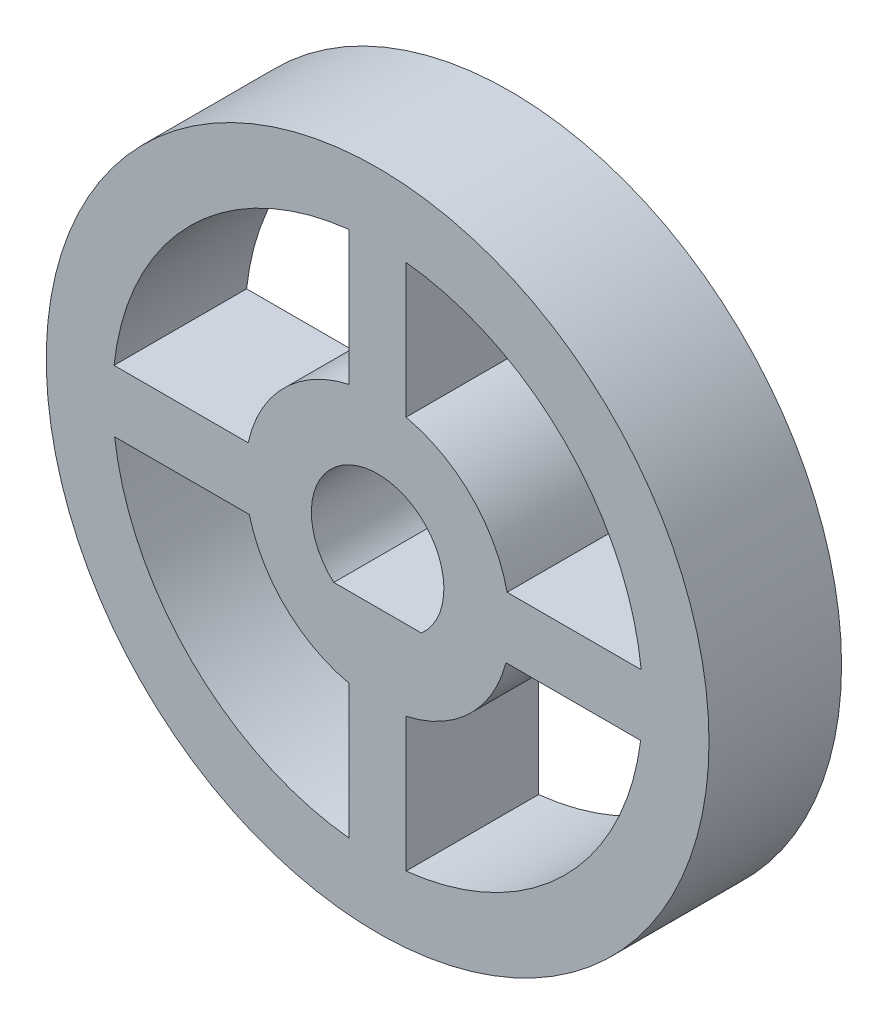
ISO-10303-21;
HEADER;
FILE_DESCRIPTION(('STEP AP214'),'2;1');
FILE_NAME('part.step','',(''),(''),'','','');
FILE_SCHEMA(('AUTOMOTIVE_DESIGN { 1 0 10303 214 1 1 1 1 }'));
ENDSEC;
DATA;
#1=APPLICATION_CONTEXT('core data for automotive mechanical design processes');
#2=APPLICATION_PROTOCOL_DEFINITION('international standard','automotive_design',2000,#1);
#3=PRODUCT_CONTEXT('',#1,'mechanical');
#4=PRODUCT('Part','Part','',(#3));
#5=PRODUCT_RELATED_PRODUCT_CATEGORY('part','',(#4));
#6=PRODUCT_DEFINITION_FORMATION('','',#4);
#7=PRODUCT_DEFINITION_CONTEXT('part definition',#1,'design');
#8=PRODUCT_DEFINITION('design','',#6,#7);
#9=PRODUCT_DEFINITION_SHAPE('','',#8);
#10=(LENGTH_UNIT() NAMED_UNIT(*) SI_UNIT(.MILLI.,.METRE.));
#11=(NAMED_UNIT(*) PLANE_ANGLE_UNIT() SI_UNIT($,.RADIAN.));
#12=(NAMED_UNIT(*) SI_UNIT($,.STERADIAN.) SOLID_ANGLE_UNIT());
#13=UNCERTAINTY_MEASURE_WITH_UNIT(LENGTH_MEASURE(1.E-05),#10,'distance_accuracy_value','');
#14=(GEOMETRIC_REPRESENTATION_CONTEXT(3) GLOBAL_UNCERTAINTY_ASSIGNED_CONTEXT((#13)) GLOBAL_UNIT_ASSIGNED_CONTEXT((#10,
#11,#12)) REPRESENTATION_CONTEXT('',''));
#15=CARTESIAN_POINT('',(0.,0.,0.));
#16=DIRECTION('',(0.,0.,1.));
#17=DIRECTION('',(1.,0.,0.));
#18=AXIS2_PLACEMENT_3D('',#15,#16,#17);
#19=CARTESIAN_POINT('',(0.,0.,6.));
#20=DIRECTION('',(0.,0.,1.));
#21=DIRECTION('',(1.,0.,0.));
#22=AXIS2_PLACEMENT_3D('',#19,#20,#21);
#23=PLANE('',#22);
#24=CARTESIAN_POINT('',(0.,0.,6.));
#25=DIRECTION('',(0.,0.,1.));
#26=DIRECTION('',(1.,0.,0.));
#27=AXIS2_PLACEMENT_3D('',#24,#25,#26);
#28=CIRCLE('',#27,15.);
#29=CARTESIAN_POINT('',(15.,0.,6.));
#30=VERTEX_POINT('',#29);
#31=EDGE_CURVE('E11',#30,#30,#28,.T.);
#32=ORIENTED_EDGE('',*,*,#31,.T.);
#33=EDGE_LOOP('',(#32));
#34=FACE_BOUND('',#33,.T.);
#35=DIRECTION('',(0.,1.,0.));
#36=VECTOR('',#35,1.);
#37=CARTESIAN_POINT('',(-1.28571428571429,5.86062614193315,6.));
#38=LINE('',#37,#36);
#39=CARTESIAN_POINT('',(-1.28571428571429,5.86062614193315,6.));
#40=VERTEX_POINT('',#39);
#41=CARTESIAN_POINT('',(-1.28571428571428,11.9309236346358,6.));
#42=VERTEX_POINT('',#41);
#43=EDGE_CURVE('E327',#40,#42,#38,.T.);
#44=ORIENTED_EDGE('',*,*,#43,.F.);
#45=CARTESIAN_POINT('',(0.,0.,6.));
#46=DIRECTION('',(0.,0.,-1.));
#47=DIRECTION('',(1.,0.,0.));
#48=AXIS2_PLACEMENT_3D('',#45,#46,#47);
#49=CIRCLE('',#48,6.);
#50=CARTESIAN_POINT('',(-5.86062614193315,1.28571428571429,6.));
#51=VERTEX_POINT('',#50);
#52=EDGE_CURVE('E324',#51,#40,#49,.T.);
#53=ORIENTED_EDGE('',*,*,#52,.F.);
#54=DIRECTION('',(1.,0.,0.));
#55=VECTOR('',#54,1.);
#56=CARTESIAN_POINT('',(-11.9309236346358,1.28571428571429,6.));
#57=LINE('',#56,#55);
#58=CARTESIAN_POINT('',(-11.9309236346358,1.28571428571429,6.));
#59=VERTEX_POINT('',#58);
#60=EDGE_CURVE('E335',#59,#51,#57,.T.);
#61=ORIENTED_EDGE('',*,*,#60,.F.);
#62=CARTESIAN_POINT('',(0.,0.,6.));
#63=DIRECTION('',(0.,0.,1.));
#64=DIRECTION('',(1.,0.,0.));
#65=AXIS2_PLACEMENT_3D('',#62,#63,#64);
#66=CIRCLE('',#65,12.);
#67=EDGE_CURVE('E331',#42,#59,#66,.T.);
#68=ORIENTED_EDGE('',*,*,#67,.F.);
#69=EDGE_LOOP('',(#44,#53,#61,#68));
#70=FACE_BOUND('',#69,.T.);
#71=DIRECTION('',(1.,0.,0.));
#72=VECTOR('',#71,1.);
#73=CARTESIAN_POINT('',(-1.98431348329844,-2.25,6.));
#74=LINE('',#73,#72);
#75=CARTESIAN_POINT('',(-1.98431348329844,-2.25,6.));
#76=VERTEX_POINT('',#75);
#77=CARTESIAN_POINT('',(1.98431348329844,-2.25,6.));
#78=VERTEX_POINT('',#77);
#79=EDGE_CURVE('E305',#76,#78,#74,.T.);
#80=ORIENTED_EDGE('',*,*,#79,.F.);
#81=CARTESIAN_POINT('',(0.,0.,6.));
#82=DIRECTION('',(0.,0.,1.));
#83=DIRECTION('',(1.,0.,0.));
#84=AXIS2_PLACEMENT_3D('',#81,#82,#83);
#85=CIRCLE('',#84,3.);
#86=EDGE_CURVE('E301',#78,#76,#85,.T.);
#87=ORIENTED_EDGE('',*,*,#86,.F.);
#88=EDGE_LOOP('',(#80,#87));
#89=FACE_BOUND('',#88,.T.);
#90=DIRECTION('',(-1.,0.,0.));
#91=VECTOR('',#90,1.);
#92=CARTESIAN_POINT('',(-11.9058808997907,-1.5,6.));
#93=LINE('',#92,#91);
#94=CARTESIAN_POINT('',(-5.80947501931112,-1.5,6.));
#95=VERTEX_POINT('',#94);
#96=CARTESIAN_POINT('',(-11.9058808997907,-1.5,6.));
#97=VERTEX_POINT('',#96);
#98=EDGE_CURVE('E261',#95,#97,#93,.T.);
#99=ORIENTED_EDGE('',*,*,#98,.F.);
#100=CARTESIAN_POINT('',(0.,0.,6.));
#101=DIRECTION('',(0.,0.,-1.));
#102=DIRECTION('',(1.,0.,0.));
#103=AXIS2_PLACEMENT_3D('',#100,#101,#102);
#104=CIRCLE('',#103,6.);
#105=CARTESIAN_POINT('',(-1.28571428571429,-5.86062614193315,6.));
#106=VERTEX_POINT('',#105);
#107=EDGE_CURVE('E258',#106,#95,#104,.T.);
#108=ORIENTED_EDGE('',*,*,#107,.F.);
#109=DIRECTION('',(0.,1.,0.));
#110=VECTOR('',#109,1.);
#111=CARTESIAN_POINT('',(-1.28571428571429,-11.9309236346358,6.));
#112=LINE('',#111,#110);
#113=CARTESIAN_POINT('',(-1.28571428571429,-11.9309236346358,6.));
#114=VERTEX_POINT('',#113);
#115=EDGE_CURVE('E269',#114,#106,#112,.T.);
#116=ORIENTED_EDGE('',*,*,#115,.F.);
#117=CARTESIAN_POINT('',(0.,0.,6.));
#118=DIRECTION('',(0.,0.,1.));
#119=DIRECTION('',(1.,0.,0.));
#120=AXIS2_PLACEMENT_3D('',#117,#118,#119);
#121=CIRCLE('',#120,12.);
#122=EDGE_CURVE('E265',#97,#114,#121,.T.);
#123=ORIENTED_EDGE('',*,*,#122,.F.);
#124=EDGE_LOOP('',(#99,#108,#116,#123));
#125=FACE_BOUND('',#124,.T.);
#126=DIRECTION('',(0.,-1.,0.));
#127=VECTOR('',#126,1.);
#128=CARTESIAN_POINT('',(1.28571428571429,5.86062614193315,6.));
#129=LINE('',#128,#127);
#130=CARTESIAN_POINT('',(1.28571428571429,11.9309236346358,6.));
#131=VERTEX_POINT('',#130);
#132=CARTESIAN_POINT('',(1.28571428571429,5.86062614193315,6.));
#133=VERTEX_POINT('',#132);
#134=EDGE_CURVE('E218',#131,#133,#129,.T.);
#135=ORIENTED_EDGE('',*,*,#134,.F.);
#136=CARTESIAN_POINT('',(0.,0.,6.));
#137=DIRECTION('',(0.,0.,1.));
#138=DIRECTION('',(1.,0.,0.));
#139=AXIS2_PLACEMENT_3D('',#136,#137,#138);
#140=CIRCLE('',#139,12.);
#141=CARTESIAN_POINT('',(11.9309236346358,1.28571428571429,6.));
#142=VERTEX_POINT('',#141);
#143=EDGE_CURVE('E215',#142,#131,#140,.T.);
#144=ORIENTED_EDGE('',*,*,#143,.F.);
#145=DIRECTION('',(1.,0.,0.));
#146=VECTOR('',#145,1.);
#147=CARTESIAN_POINT('',(5.86062614193315,1.28571428571429,6.));
#148=LINE('',#147,#146);
#149=CARTESIAN_POINT('',(5.86062614193315,1.28571428571429,6.));
#150=VERTEX_POINT('',#149);
#151=EDGE_CURVE('E226',#150,#142,#148,.T.);
#152=ORIENTED_EDGE('',*,*,#151,.F.);
#153=CARTESIAN_POINT('',(0.,0.,6.));
#154=DIRECTION('',(0.,0.,-1.));
#155=DIRECTION('',(1.,0.,0.));
#156=AXIS2_PLACEMENT_3D('',#153,#154,#155);
#157=CIRCLE('',#156,6.);
#158=EDGE_CURVE('E222',#133,#150,#157,.T.);
#159=ORIENTED_EDGE('',*,*,#158,.F.);
#160=EDGE_LOOP('',(#135,#144,#152,#159));
#161=FACE_BOUND('',#160,.T.);
#162=DIRECTION('',(0.,-1.,0.));
#163=VECTOR('',#162,1.);
#164=CARTESIAN_POINT('',(1.28571428571429,-11.9309236346358,6.));
#165=LINE('',#164,#163);
#166=CARTESIAN_POINT('',(1.28571428571429,-5.86062614193315,6.));
#167=VERTEX_POINT('',#166);
#168=CARTESIAN_POINT('',(1.28571428571428,-11.9309236346358,6.));
#169=VERTEX_POINT('',#168);
#170=EDGE_CURVE('E175',#167,#169,#165,.T.);
#171=ORIENTED_EDGE('',*,*,#170,.F.);
#172=CARTESIAN_POINT('',(0.,0.,6.));
#173=DIRECTION('',(0.,0.,-1.));
#174=DIRECTION('',(1.,0.,0.));
#175=AXIS2_PLACEMENT_3D('',#172,#173,#174);
#176=CIRCLE('',#175,6.);
#177=CARTESIAN_POINT('',(5.80947501931112,-1.5,6.));
#178=VERTEX_POINT('',#177);
#179=EDGE_CURVE('E166',#178,#167,#176,.T.);
#180=ORIENTED_EDGE('',*,*,#179,.F.);
#181=DIRECTION('',(-1.,0.,0.));
#182=VECTOR('',#181,1.);
#183=CARTESIAN_POINT('',(5.80947501931112,-1.5,6.));
#184=LINE('',#183,#182);
#185=CARTESIAN_POINT('',(11.9058808997907,-1.5,6.));
#186=VERTEX_POINT('',#185);
#187=EDGE_CURVE('E193',#186,#178,#184,.T.);
#188=ORIENTED_EDGE('',*,*,#187,.F.);
#189=CARTESIAN_POINT('',(0.,0.,6.));
#190=DIRECTION('',(0.,0.,1.));
#191=DIRECTION('',(1.,0.,0.));
#192=AXIS2_PLACEMENT_3D('',#189,#190,#191);
#193=CIRCLE('',#192,12.);
#194=EDGE_CURVE('E188',#169,#186,#193,.T.);
#195=ORIENTED_EDGE('',*,*,#194,.F.);
#196=EDGE_LOOP('',(#171,#180,#188,#195));
#197=FACE_BOUND('',#196,.T.);
#198=ADVANCED_FACE('F40',(#34,#70,#89,#125,#161,#197),#23,.T.);
#199=CARTESIAN_POINT('',(0.,0.,0.));
#200=DIRECTION('',(0.,0.,1.));
#201=DIRECTION('',(1.,0.,0.));
#202=AXIS2_PLACEMENT_3D('',#199,#200,#201);
#203=PLANE('',#202);
#204=CARTESIAN_POINT('',(0.,0.,0.));
#205=DIRECTION('',(0.,0.,1.));
#206=DIRECTION('',(1.,0.,0.));
#207=AXIS2_PLACEMENT_3D('',#204,#205,#206);
#208=CIRCLE('',#207,12.);
#209=CARTESIAN_POINT('',(11.9309236346358,1.28571428571429,0.));
#210=VERTEX_POINT('',#209);
#211=CARTESIAN_POINT('',(1.28571428571429,11.9309236346358,0.));
#212=VERTEX_POINT('',#211);
#213=EDGE_CURVE('E184',#210,#212,#208,.T.);
#214=ORIENTED_EDGE('',*,*,#213,.T.);
#215=DIRECTION('',(0.,-1.,0.));
#216=VECTOR('',#215,1.);
#217=CARTESIAN_POINT('',(1.28571428571429,5.86062614193315,0.));
#218=LINE('',#217,#216);
#219=CARTESIAN_POINT('',(1.28571428571429,5.86062614193315,0.));
#220=VERTEX_POINT('',#219);
#221=EDGE_CURVE('E233',#212,#220,#218,.T.);
#222=ORIENTED_EDGE('',*,*,#221,.T.);
#223=CARTESIAN_POINT('',(0.,0.,0.));
#224=DIRECTION('',(0.,0.,-1.));
#225=DIRECTION('',(1.,0.,0.));
#226=AXIS2_PLACEMENT_3D('',#223,#224,#225);
#227=CIRCLE('',#226,6.);
#228=CARTESIAN_POINT('',(5.86062614193315,1.28571428571429,0.));
#229=VERTEX_POINT('',#228);
#230=EDGE_CURVE('E237',#220,#229,#227,.T.);
#231=ORIENTED_EDGE('',*,*,#230,.T.);
#232=DIRECTION('',(1.,0.,0.));
#233=VECTOR('',#232,1.);
#234=CARTESIAN_POINT('',(5.86062614193315,1.28571428571429,0.));
#235=LINE('',#234,#233);
#236=EDGE_CURVE('E219',#229,#210,#235,.T.);
#237=ORIENTED_EDGE('',*,*,#236,.T.);
#238=EDGE_LOOP('',(#214,#222,#231,#237));
#239=FACE_BOUND('',#238,.T.);
#240=CARTESIAN_POINT('',(0.,0.,0.));
#241=DIRECTION('',(0.,0.,1.));
#242=DIRECTION('',(1.,0.,0.));
#243=AXIS2_PLACEMENT_3D('',#240,#241,#242);
#244=CIRCLE('',#243,3.);
#245=CARTESIAN_POINT('',(1.98431348329844,-2.25,0.));
#246=VERTEX_POINT('',#245);
#247=CARTESIAN_POINT('',(-1.98431348329844,-2.25,0.));
#248=VERTEX_POINT('',#247);
#249=EDGE_CURVE('E300',#246,#248,#244,.T.);
#250=ORIENTED_EDGE('',*,*,#249,.T.);
#251=DIRECTION('',(1.,0.,0.));
#252=VECTOR('',#251,1.);
#253=CARTESIAN_POINT('',(-1.98431348329844,-2.25,0.));
#254=LINE('',#253,#252);
#255=EDGE_CURVE('E306',#248,#246,#254,.T.);
#256=ORIENTED_EDGE('',*,*,#255,.T.);
#257=EDGE_LOOP('',(#250,#256));
#258=FACE_BOUND('',#257,.T.);
#259=CARTESIAN_POINT('',(0.,0.,0.));
#260=DIRECTION('',(0.,0.,1.));
#261=DIRECTION('',(1.,0.,0.));
#262=AXIS2_PLACEMENT_3D('',#259,#260,#261);
#263=CIRCLE('',#262,15.);
#264=CARTESIAN_POINT('',(15.,0.,0.));
#265=VERTEX_POINT('',#264);
#266=EDGE_CURVE('E44',#265,#265,#263,.T.);
#267=ORIENTED_EDGE('',*,*,#266,.F.);
#268=EDGE_LOOP('',(#267));
#269=FACE_BOUND('',#268,.T.);
#270=CARTESIAN_POINT('',(0.,0.,0.));
#271=DIRECTION('',(0.,0.,-1.));
#272=DIRECTION('',(1.,0.,0.));
#273=AXIS2_PLACEMENT_3D('',#270,#271,#272);
#274=CIRCLE('',#273,6.);
#275=CARTESIAN_POINT('',(-5.86062614193315,1.28571428571429,0.));
#276=VERTEX_POINT('',#275);
#277=CARTESIAN_POINT('',(-1.28571428571429,5.86062614193315,0.));
#278=VERTEX_POINT('',#277);
#279=EDGE_CURVE('E323',#276,#278,#274,.T.);
#280=ORIENTED_EDGE('',*,*,#279,.T.);
#281=DIRECTION('',(0.,1.,0.));
#282=VECTOR('',#281,1.);
#283=CARTESIAN_POINT('',(-1.28571428571429,5.86062614193315,0.));
#284=LINE('',#283,#282);
#285=CARTESIAN_POINT('',(-1.28571428571428,11.9309236346358,0.));
#286=VERTEX_POINT('',#285);
#287=EDGE_CURVE('E342',#278,#286,#284,.T.);
#288=ORIENTED_EDGE('',*,*,#287,.T.);
#289=CARTESIAN_POINT('',(0.,0.,0.));
#290=DIRECTION('',(0.,0.,1.));
#291=DIRECTION('',(1.,0.,0.));
#292=AXIS2_PLACEMENT_3D('',#289,#290,#291);
#293=CIRCLE('',#292,12.);
#294=CARTESIAN_POINT('',(-11.9309236346358,1.28571428571429,0.));
#295=VERTEX_POINT('',#294);
#296=EDGE_CURVE('E346',#286,#295,#293,.T.);
#297=ORIENTED_EDGE('',*,*,#296,.T.);
#298=DIRECTION('',(1.,0.,0.));
#299=VECTOR('',#298,1.);
#300=CARTESIAN_POINT('',(-11.9309236346358,1.28571428571429,0.));
#301=LINE('',#300,#299);
#302=EDGE_CURVE('E328',#295,#276,#301,.T.);
#303=ORIENTED_EDGE('',*,*,#302,.T.);
#304=EDGE_LOOP('',(#280,#288,#297,#303));
#305=FACE_BOUND('',#304,.T.);
#306=CARTESIAN_POINT('',(0.,0.,0.));
#307=DIRECTION('',(0.,0.,-1.));
#308=DIRECTION('',(1.,0.,0.));
#309=AXIS2_PLACEMENT_3D('',#306,#307,#308);
#310=CIRCLE('',#309,6.);
#311=CARTESIAN_POINT('',(-1.28571428571429,-5.86062614193315,0.));
#312=VERTEX_POINT('',#311);
#313=CARTESIAN_POINT('',(-5.80947501931112,-1.5,0.));
#314=VERTEX_POINT('',#313);
#315=EDGE_CURVE('E257',#312,#314,#310,.T.);
#316=ORIENTED_EDGE('',*,*,#315,.T.);
#317=DIRECTION('',(-1.,0.,0.));
#318=VECTOR('',#317,1.);
#319=CARTESIAN_POINT('',(-11.9058808997907,-1.5,0.));
#320=LINE('',#319,#318);
#321=CARTESIAN_POINT('',(-11.9058808997907,-1.5,0.));
#322=VERTEX_POINT('',#321);
#323=EDGE_CURVE('E276',#314,#322,#320,.T.);
#324=ORIENTED_EDGE('',*,*,#323,.T.);
#325=CARTESIAN_POINT('',(0.,0.,0.));
#326=DIRECTION('',(0.,0.,1.));
#327=DIRECTION('',(1.,0.,0.));
#328=AXIS2_PLACEMENT_3D('',#325,#326,#327);
#329=CIRCLE('',#328,12.);
#330=CARTESIAN_POINT('',(-1.28571428571428,-11.9309236346358,0.));
#331=VERTEX_POINT('',#330);
#332=EDGE_CURVE('E280',#322,#331,#329,.T.);
#333=ORIENTED_EDGE('',*,*,#332,.T.);
#334=DIRECTION('',(0.,1.,0.));
#335=VECTOR('',#334,1.);
#336=CARTESIAN_POINT('',(-1.28571428571429,-11.9309236346358,0.));
#337=LINE('',#336,#335);
#338=EDGE_CURVE('E262',#331,#312,#337,.T.);
#339=ORIENTED_EDGE('',*,*,#338,.T.);
#340=EDGE_LOOP('',(#316,#324,#333,#339));
#341=FACE_BOUND('',#340,.T.);
#342=CARTESIAN_POINT('',(0.,0.,0.));
#343=DIRECTION('',(0.,0.,-1.));
#344=DIRECTION('',(1.,0.,0.));
#345=AXIS2_PLACEMENT_3D('',#342,#343,#344);
#346=CIRCLE('',#345,6.);
#347=CARTESIAN_POINT('',(5.80947501931112,-1.5,0.));
#348=VERTEX_POINT('',#347);
#349=CARTESIAN_POINT('',(1.28571428571429,-5.86062614193315,0.));
#350=VERTEX_POINT('',#349);
#351=EDGE_CURVE('E64',#348,#350,#346,.T.);
#352=ORIENTED_EDGE('',*,*,#351,.T.);
#353=DIRECTION('',(0.,-1.,0.));
#354=VECTOR('',#353,1.);
#355=CARTESIAN_POINT('',(1.28571428571429,-11.9309236346358,0.));
#356=LINE('',#355,#354);
#357=CARTESIAN_POINT('',(1.28571428571428,-11.9309236346358,0.));
#358=VERTEX_POINT('',#357);
#359=EDGE_CURVE('E182',#350,#358,#356,.T.);
#360=ORIENTED_EDGE('',*,*,#359,.T.);
#361=CARTESIAN_POINT('',(0.,0.,0.));
#362=DIRECTION('',(0.,0.,1.));
#363=DIRECTION('',(1.,0.,0.));
#364=AXIS2_PLACEMENT_3D('',#361,#362,#363);
#365=CIRCLE('',#364,12.);
#366=CARTESIAN_POINT('',(11.9058808997907,-1.5,0.));
#367=VERTEX_POINT('',#366);
#368=EDGE_CURVE('E202',#358,#367,#365,.T.);
#369=ORIENTED_EDGE('',*,*,#368,.T.);
#370=DIRECTION('',(-1.,0.,0.));
#371=VECTOR('',#370,1.);
#372=CARTESIAN_POINT('',(5.80947501931112,-1.5,0.));
#373=LINE('',#372,#371);
#374=EDGE_CURVE('E176',#367,#348,#373,.T.);
#375=ORIENTED_EDGE('',*,*,#374,.T.);
#376=EDGE_LOOP('',(#352,#360,#369,#375));
#377=FACE_BOUND('',#376,.T.);
#378=ADVANCED_FACE('F374',(#239,#258,#269,#305,#341,#377),#203,.F.);
#379=CARTESIAN_POINT('',(0.,0.,6.));
#380=DIRECTION('',(0.,0.,-1.));
#381=DIRECTION('',(-1.,0.,0.));
#382=AXIS2_PLACEMENT_3D('',#379,#380,#381);
#383=CYLINDRICAL_SURFACE('',#382,15.);
#384=ORIENTED_EDGE('',*,*,#31,.F.);
#385=EDGE_LOOP('',(#384));
#386=FACE_BOUND('',#385,.T.);
#387=ORIENTED_EDGE('',*,*,#266,.T.);
#388=EDGE_LOOP('',(#387));
#389=FACE_BOUND('',#388,.T.);
#390=ADVANCED_FACE('F42',(#386,#389),#383,.T.);
#391=CARTESIAN_POINT('',(0.,0.,6.));
#392=DIRECTION('',(0.,0.,-1.));
#393=DIRECTION('',(-1.,0.,0.));
#394=AXIS2_PLACEMENT_3D('',#391,#392,#393);
#395=CYLINDRICAL_SURFACE('',#394,6.);
#396=ORIENTED_EDGE('',*,*,#279,.F.);
#397=DIRECTION('',(0.,0.,-1.));
#398=VECTOR('',#397,1.);
#399=CARTESIAN_POINT('',(-5.86062614193315,1.28571428571429,6.));
#400=LINE('',#399,#398);
#401=EDGE_CURVE('E338',#51,#276,#400,.T.);
#402=ORIENTED_EDGE('',*,*,#401,.F.);
#403=ORIENTED_EDGE('',*,*,#52,.T.);
#404=DIRECTION('',(0.,0.,-1.));
#405=VECTOR('',#404,1.);
#406=CARTESIAN_POINT('',(-1.28571428571429,5.86062614193315,6.));
#407=LINE('',#406,#405);
#408=EDGE_CURVE('E362',#40,#278,#407,.T.);
#409=ORIENTED_EDGE('',*,*,#408,.T.);
#410=EDGE_LOOP('',(#396,#402,#403,#409));
#411=FACE_BOUND('',#410,.T.);
#412=ADVANCED_FACE('F397',(#411),#395,.T.);
#413=CARTESIAN_POINT('',(-1.28571428571429,5.86062614193315,6.));
#414=DIRECTION('',(-1.,0.,0.));
#415=DIRECTION('',(0.,0.,1.));
#416=AXIS2_PLACEMENT_3D('',#413,#414,#415);
#417=PLANE('',#416);
#418=ORIENTED_EDGE('',*,*,#287,.F.);
#419=ORIENTED_EDGE('',*,*,#408,.F.);
#420=ORIENTED_EDGE('',*,*,#43,.T.);
#421=DIRECTION('',(0.,0.,-1.));
#422=VECTOR('',#421,1.);
#423=CARTESIAN_POINT('',(-1.28571428571428,11.9309236346358,6.));
#424=LINE('',#423,#422);
#425=EDGE_CURVE('E359',#42,#286,#424,.T.);
#426=ORIENTED_EDGE('',*,*,#425,.T.);
#427=EDGE_LOOP('',(#418,#419,#420,#426));
#428=FACE_BOUND('',#427,.T.);
#429=ADVANCED_FACE('F400',(#428),#417,.T.);
#430=CARTESIAN_POINT('',(0.,0.,6.));
#431=DIRECTION('',(0.,0.,-1.));
#432=DIRECTION('',(-1.,0.,0.));
#433=AXIS2_PLACEMENT_3D('',#430,#431,#432);
#434=CYLINDRICAL_SURFACE('',#433,12.);
#435=ORIENTED_EDGE('',*,*,#296,.F.);
#436=ORIENTED_EDGE('',*,*,#425,.F.);
#437=ORIENTED_EDGE('',*,*,#67,.T.);
#438=DIRECTION('',(0.,0.,-1.));
#439=VECTOR('',#438,1.);
#440=CARTESIAN_POINT('',(-11.9309236346358,1.28571428571429,6.));
#441=LINE('',#440,#439);
#442=EDGE_CURVE('E356',#59,#295,#441,.T.);
#443=ORIENTED_EDGE('',*,*,#442,.T.);
#444=EDGE_LOOP('',(#435,#436,#437,#443));
#445=FACE_BOUND('',#444,.T.);
#446=ADVANCED_FACE('F403',(#445),#434,.F.);
#447=CARTESIAN_POINT('',(-11.9309236346358,1.28571428571429,6.));
#448=DIRECTION('',(0.,1.,0.));
#449=DIRECTION('',(0.,0.,1.));
#450=AXIS2_PLACEMENT_3D('',#447,#448,#449);
#451=PLANE('',#450);
#452=ORIENTED_EDGE('',*,*,#302,.F.);
#453=ORIENTED_EDGE('',*,*,#442,.F.);
#454=ORIENTED_EDGE('',*,*,#60,.T.);
#455=ORIENTED_EDGE('',*,*,#401,.T.);
#456=EDGE_LOOP('',(#452,#453,#454,#455));
#457=FACE_BOUND('',#456,.T.);
#458=ADVANCED_FACE('F407',(#457),#451,.T.);
#459=CARTESIAN_POINT('',(0.,0.,6.));
#460=DIRECTION('',(0.,0.,-1.));
#461=DIRECTION('',(-1.,0.,0.));
#462=AXIS2_PLACEMENT_3D('',#459,#460,#461);
#463=CYLINDRICAL_SURFACE('',#462,3.);
#464=ORIENTED_EDGE('',*,*,#249,.F.);
#465=DIRECTION('',(0.,0.,-1.));
#466=VECTOR('',#465,1.);
#467=CARTESIAN_POINT('',(1.98431348329844,-2.25,6.));
#468=LINE('',#467,#466);
#469=EDGE_CURVE('E309',#78,#246,#468,.T.);
#470=ORIENTED_EDGE('',*,*,#469,.F.);
#471=ORIENTED_EDGE('',*,*,#86,.T.);
#472=DIRECTION('',(0.,0.,-1.));
#473=VECTOR('',#472,1.);
#474=CARTESIAN_POINT('',(-1.98431348329844,-2.25,6.));
#475=LINE('',#474,#473);
#476=EDGE_CURVE('E319',#76,#248,#475,.T.);
#477=ORIENTED_EDGE('',*,*,#476,.T.);
#478=EDGE_LOOP('',(#464,#470,#471,#477));
#479=FACE_BOUND('',#478,.T.);
#480=ADVANCED_FACE('F411',(#479),#463,.F.);
#481=CARTESIAN_POINT('',(-1.98431348329844,-2.25,6.));
#482=DIRECTION('',(0.,1.,0.));
#483=DIRECTION('',(0.,0.,1.));
#484=AXIS2_PLACEMENT_3D('',#481,#482,#483);
#485=PLANE('',#484);
#486=ORIENTED_EDGE('',*,*,#255,.F.);
#487=ORIENTED_EDGE('',*,*,#476,.F.);
#488=ORIENTED_EDGE('',*,*,#79,.T.);
#489=ORIENTED_EDGE('',*,*,#469,.T.);
#490=EDGE_LOOP('',(#486,#487,#488,#489));
#491=FACE_BOUND('',#490,.T.);
#492=ADVANCED_FACE('F415',(#491),#485,.T.);
#493=CARTESIAN_POINT('',(0.,0.,6.));
#494=DIRECTION('',(0.,0.,-1.));
#495=DIRECTION('',(-1.,0.,0.));
#496=AXIS2_PLACEMENT_3D('',#493,#494,#495);
#497=CYLINDRICAL_SURFACE('',#496,6.);
#498=ORIENTED_EDGE('',*,*,#315,.F.);
#499=DIRECTION('',(0.,0.,-1.));
#500=VECTOR('',#499,1.);
#501=CARTESIAN_POINT('',(-1.28571428571429,-5.86062614193315,6.));
#502=LINE('',#501,#500);
#503=EDGE_CURVE('E272',#106,#312,#502,.T.);
#504=ORIENTED_EDGE('',*,*,#503,.F.);
#505=ORIENTED_EDGE('',*,*,#107,.T.);
#506=DIRECTION('',(0.,0.,-1.));
#507=VECTOR('',#506,1.);
#508=CARTESIAN_POINT('',(-5.80947501931112,-1.5,6.));
#509=LINE('',#508,#507);
#510=EDGE_CURVE('E296',#95,#314,#509,.T.);
#511=ORIENTED_EDGE('',*,*,#510,.T.);
#512=EDGE_LOOP('',(#498,#504,#505,#511));
#513=FACE_BOUND('',#512,.T.);
#514=ADVANCED_FACE('F419',(#513),#497,.T.);
#515=CARTESIAN_POINT('',(-11.9058808997907,-1.5,6.));
#516=DIRECTION('',(0.,-1.,0.));
#517=DIRECTION('',(1.,0.,0.));
#518=AXIS2_PLACEMENT_3D('',#515,#516,#517);
#519=PLANE('',#518);
#520=ORIENTED_EDGE('',*,*,#323,.F.);
#521=ORIENTED_EDGE('',*,*,#510,.F.);
#522=ORIENTED_EDGE('',*,*,#98,.T.);
#523=DIRECTION('',(0.,0.,-1.));
#524=VECTOR('',#523,1.);
#525=CARTESIAN_POINT('',(-11.9058808997907,-1.5,6.));
#526=LINE('',#525,#524);
#527=EDGE_CURVE('E293',#97,#322,#526,.T.);
#528=ORIENTED_EDGE('',*,*,#527,.T.);
#529=EDGE_LOOP('',(#520,#521,#522,#528));
#530=FACE_BOUND('',#529,.T.);
#531=ADVANCED_FACE('F423',(#530),#519,.T.);
#532=CARTESIAN_POINT('',(0.,0.,6.));
#533=DIRECTION('',(0.,0.,-1.));
#534=DIRECTION('',(-1.,0.,0.));
#535=AXIS2_PLACEMENT_3D('',#532,#533,#534);
#536=CYLINDRICAL_SURFACE('',#535,12.);
#537=ORIENTED_EDGE('',*,*,#332,.F.);
#538=ORIENTED_EDGE('',*,*,#527,.F.);
#539=ORIENTED_EDGE('',*,*,#122,.T.);
#540=DIRECTION('',(0.,0.,-1.));
#541=VECTOR('',#540,1.);
#542=CARTESIAN_POINT('',(-1.28571428571428,-11.9309236346358,6.));
#543=LINE('',#542,#541);
#544=EDGE_CURVE('E290',#114,#331,#543,.T.);
#545=ORIENTED_EDGE('',*,*,#544,.T.);
#546=EDGE_LOOP('',(#537,#538,#539,#545));
#547=FACE_BOUND('',#546,.T.);
#548=ADVANCED_FACE('F427',(#547),#536,.F.);
#549=CARTESIAN_POINT('',(-1.28571428571429,-11.9309236346358,6.));
#550=DIRECTION('',(-1.,0.,0.));
#551=DIRECTION('',(0.,0.,1.));
#552=AXIS2_PLACEMENT_3D('',#549,#550,#551);
#553=PLANE('',#552);
#554=ORIENTED_EDGE('',*,*,#338,.F.);
#555=ORIENTED_EDGE('',*,*,#544,.F.);
#556=ORIENTED_EDGE('',*,*,#115,.T.);
#557=ORIENTED_EDGE('',*,*,#503,.T.);
#558=EDGE_LOOP('',(#554,#555,#556,#557));
#559=FACE_BOUND('',#558,.T.);
#560=ADVANCED_FACE('F431',(#559),#553,.T.);
#561=CARTESIAN_POINT('',(0.,0.,6.));
#562=DIRECTION('',(0.,0.,-1.));
#563=DIRECTION('',(-1.,0.,0.));
#564=AXIS2_PLACEMENT_3D('',#561,#562,#563);
#565=CYLINDRICAL_SURFACE('',#564,12.);
#566=ORIENTED_EDGE('',*,*,#213,.F.);
#567=DIRECTION('',(0.,0.,-1.));
#568=VECTOR('',#567,1.);
#569=CARTESIAN_POINT('',(11.9309236346358,1.28571428571429,6.));
#570=LINE('',#569,#568);
#571=EDGE_CURVE('E229',#142,#210,#570,.T.);
#572=ORIENTED_EDGE('',*,*,#571,.F.);
#573=ORIENTED_EDGE('',*,*,#143,.T.);
#574=DIRECTION('',(0.,0.,-1.));
#575=VECTOR('',#574,1.);
#576=CARTESIAN_POINT('',(1.28571428571429,11.9309236346358,6.));
#577=LINE('',#576,#575);
#578=EDGE_CURVE('E253',#131,#212,#577,.T.);
#579=ORIENTED_EDGE('',*,*,#578,.T.);
#580=EDGE_LOOP('',(#566,#572,#573,#579));
#581=FACE_BOUND('',#580,.T.);
#582=ADVANCED_FACE('F435',(#581),#565,.F.);
#583=CARTESIAN_POINT('',(1.28571428571429,5.86062614193315,6.));
#584=DIRECTION('',(1.,0.,0.));
#585=DIRECTION('',(0.,0.,-1.));
#586=AXIS2_PLACEMENT_3D('',#583,#584,#585);
#587=PLANE('',#586);
#588=ORIENTED_EDGE('',*,*,#221,.F.);
#589=ORIENTED_EDGE('',*,*,#578,.F.);
#590=ORIENTED_EDGE('',*,*,#134,.T.);
#591=DIRECTION('',(0.,0.,-1.));
#592=VECTOR('',#591,1.);
#593=CARTESIAN_POINT('',(1.28571428571429,5.86062614193315,6.));
#594=LINE('',#593,#592);
#595=EDGE_CURVE('E250',#133,#220,#594,.T.);
#596=ORIENTED_EDGE('',*,*,#595,.T.);
#597=EDGE_LOOP('',(#588,#589,#590,#596));
#598=FACE_BOUND('',#597,.T.);
#599=ADVANCED_FACE('F439',(#598),#587,.T.);
#600=CARTESIAN_POINT('',(0.,0.,6.));
#601=DIRECTION('',(0.,0.,-1.));
#602=DIRECTION('',(-1.,0.,0.));
#603=AXIS2_PLACEMENT_3D('',#600,#601,#602);
#604=CYLINDRICAL_SURFACE('',#603,6.);
#605=ORIENTED_EDGE('',*,*,#230,.F.);
#606=ORIENTED_EDGE('',*,*,#595,.F.);
#607=ORIENTED_EDGE('',*,*,#158,.T.);
#608=DIRECTION('',(0.,0.,-1.));
#609=VECTOR('',#608,1.);
#610=CARTESIAN_POINT('',(5.86062614193315,1.28571428571429,6.));
#611=LINE('',#610,#609);
#612=EDGE_CURVE('E247',#150,#229,#611,.T.);
#613=ORIENTED_EDGE('',*,*,#612,.T.);
#614=EDGE_LOOP('',(#605,#606,#607,#613));
#615=FACE_BOUND('',#614,.T.);
#616=ADVANCED_FACE('F443',(#615),#604,.T.);
#617=CARTESIAN_POINT('',(5.86062614193315,1.28571428571429,6.));
#618=DIRECTION('',(0.,1.,0.));
#619=DIRECTION('',(0.,0.,1.));
#620=AXIS2_PLACEMENT_3D('',#617,#618,#619);
#621=PLANE('',#620);
#622=ORIENTED_EDGE('',*,*,#236,.F.);
#623=ORIENTED_EDGE('',*,*,#612,.F.);
#624=ORIENTED_EDGE('',*,*,#151,.T.);
#625=ORIENTED_EDGE('',*,*,#571,.T.);
#626=EDGE_LOOP('',(#622,#623,#624,#625));
#627=FACE_BOUND('',#626,.T.);
#628=ADVANCED_FACE('F447',(#627),#621,.T.);
#629=CARTESIAN_POINT('',(0.,0.,6.));
#630=DIRECTION('',(0.,0.,-1.));
#631=DIRECTION('',(-1.,0.,0.));
#632=AXIS2_PLACEMENT_3D('',#629,#630,#631);
#633=CYLINDRICAL_SURFACE('',#632,6.);
#634=ORIENTED_EDGE('',*,*,#351,.F.);
#635=DIRECTION('',(0.,0.,-1.));
#636=VECTOR('',#635,1.);
#637=CARTESIAN_POINT('',(5.80947501931112,-1.5,6.));
#638=LINE('',#637,#636);
#639=EDGE_CURVE('E170',#178,#348,#638,.T.);
#640=ORIENTED_EDGE('',*,*,#639,.F.);
#641=ORIENTED_EDGE('',*,*,#179,.T.);
#642=DIRECTION('',(0.,0.,-1.));
#643=VECTOR('',#642,1.);
#644=CARTESIAN_POINT('',(1.28571428571429,-5.86062614193315,6.));
#645=LINE('',#644,#643);
#646=EDGE_CURVE('E169',#167,#350,#645,.T.);
#647=ORIENTED_EDGE('',*,*,#646,.T.);
#648=EDGE_LOOP('',(#634,#640,#641,#647));
#649=FACE_BOUND('',#648,.T.);
#650=ADVANCED_FACE('F168',(#649),#633,.T.);
#651=CARTESIAN_POINT('',(1.28571428571429,-11.9309236346358,6.));
#652=DIRECTION('',(1.,0.,0.));
#653=DIRECTION('',(0.,0.,-1.));
#654=AXIS2_PLACEMENT_3D('',#651,#652,#653);
#655=PLANE('',#654);
#656=ORIENTED_EDGE('',*,*,#359,.F.);
#657=ORIENTED_EDGE('',*,*,#646,.F.);
#658=ORIENTED_EDGE('',*,*,#170,.T.);
#659=DIRECTION('',(0.,0.,-1.));
#660=VECTOR('',#659,1.);
#661=CARTESIAN_POINT('',(1.28571428571428,-11.9309236346358,6.));
#662=LINE('',#661,#660);
#663=EDGE_CURVE('E185',#169,#358,#662,.T.);
#664=ORIENTED_EDGE('',*,*,#663,.T.);
#665=EDGE_LOOP('',(#656,#657,#658,#664));
#666=FACE_BOUND('',#665,.T.);
#667=ADVANCED_FACE('F179',(#666),#655,.T.);
#668=CARTESIAN_POINT('',(0.,0.,6.));
#669=DIRECTION('',(0.,0.,-1.));
#670=DIRECTION('',(-1.,0.,0.));
#671=AXIS2_PLACEMENT_3D('',#668,#669,#670);
#672=CYLINDRICAL_SURFACE('',#671,12.);
#673=ORIENTED_EDGE('',*,*,#368,.F.);
#674=ORIENTED_EDGE('',*,*,#663,.F.);
#675=ORIENTED_EDGE('',*,*,#194,.T.);
#676=DIRECTION('',(0.,0.,-1.));
#677=VECTOR('',#676,1.);
#678=CARTESIAN_POINT('',(11.9058808997907,-1.5,6.));
#679=LINE('',#678,#677);
#680=EDGE_CURVE('E56',#186,#367,#679,.T.);
#681=ORIENTED_EDGE('',*,*,#680,.T.);
#682=EDGE_LOOP('',(#673,#674,#675,#681));
#683=FACE_BOUND('',#682,.T.);
#684=ADVANCED_FACE('F383',(#683),#672,.F.);
#685=CARTESIAN_POINT('',(5.80947501931112,-1.5,6.));
#686=DIRECTION('',(0.,-1.,0.));
#687=DIRECTION('',(1.,0.,0.));
#688=AXIS2_PLACEMENT_3D('',#685,#686,#687);
#689=PLANE('',#688);
#690=ORIENTED_EDGE('',*,*,#374,.F.);
#691=ORIENTED_EDGE('',*,*,#680,.F.);
#692=ORIENTED_EDGE('',*,*,#187,.T.);
#693=ORIENTED_EDGE('',*,*,#639,.T.);
#694=EDGE_LOOP('',(#690,#691,#692,#693));
#695=FACE_BOUND('',#694,.T.);
#696=ADVANCED_FACE('F381',(#695),#689,.T.);
#697=CLOSED_SHELL('',(#198,#378,#390,#412,#429,#446,#458,#480,#492,#514,#531,#548,#560,#582,
#599,#616,#628,#650,#667,#684,#696));
#698=MANIFOLD_SOLID_BREP('B2',#697);
#699=ADVANCED_BREP_SHAPE_REPRESENTATION('',(#18,#698),#14);
#700=SHAPE_DEFINITION_REPRESENTATION(#9,#699);
ENDSEC;
END-ISO-10303-21;
